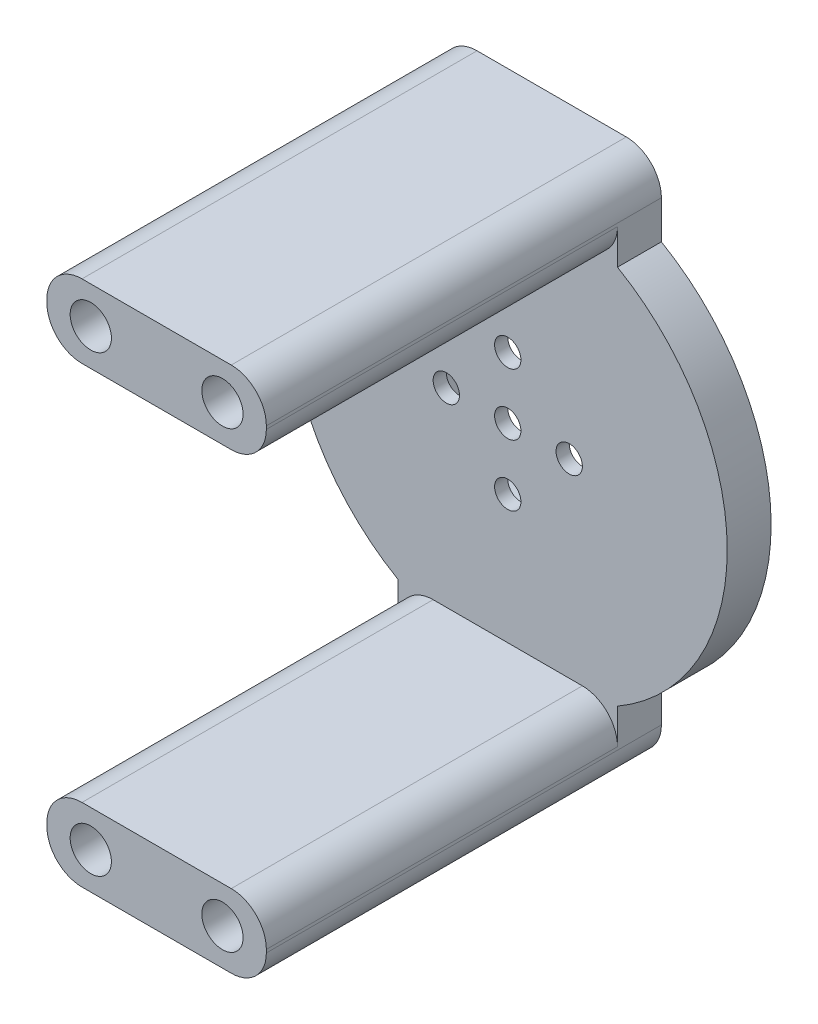
ISO-10303-21;
HEADER;
FILE_DESCRIPTION(('STEP AP214'),'2;1');
FILE_NAME('part.step','',(''),(''),'','','');
FILE_SCHEMA(('AUTOMOTIVE_DESIGN { 1 0 10303 214 1 1 1 1 }'));
ENDSEC;
DATA;
#1=APPLICATION_CONTEXT('core data for automotive mechanical design processes');
#2=APPLICATION_PROTOCOL_DEFINITION('international standard','automotive_design',2000,#1);
#3=PRODUCT_CONTEXT('',#1,'mechanical');
#4=PRODUCT('Part','Part','',(#3));
#5=PRODUCT_RELATED_PRODUCT_CATEGORY('part','',(#4));
#6=PRODUCT_DEFINITION_FORMATION('','',#4);
#7=PRODUCT_DEFINITION_CONTEXT('part definition',#1,'design');
#8=PRODUCT_DEFINITION('design','',#6,#7);
#9=PRODUCT_DEFINITION_SHAPE('','',#8);
#10=(LENGTH_UNIT() NAMED_UNIT(*) SI_UNIT(.MILLI.,.METRE.));
#11=(NAMED_UNIT(*) PLANE_ANGLE_UNIT() SI_UNIT($,.RADIAN.));
#12=(NAMED_UNIT(*) SI_UNIT($,.STERADIAN.) SOLID_ANGLE_UNIT());
#13=UNCERTAINTY_MEASURE_WITH_UNIT(LENGTH_MEASURE(1.E-05),#10,'distance_accuracy_value','');
#14=(GEOMETRIC_REPRESENTATION_CONTEXT(3) GLOBAL_UNCERTAINTY_ASSIGNED_CONTEXT((#13)) GLOBAL_UNIT_ASSIGNED_CONTEXT((#10,
#11,#12)) REPRESENTATION_CONTEXT('',''));
#15=CARTESIAN_POINT('',(0.,0.,0.));
#16=DIRECTION('',(0.,0.,1.));
#17=DIRECTION('',(1.,0.,0.));
#18=AXIS2_PLACEMENT_3D('',#15,#16,#17);
#19=CARTESIAN_POINT('',(0.,0.,5.));
#20=DIRECTION('',(0.,0.,1.));
#21=DIRECTION('',(1.,0.,0.));
#22=AXIS2_PLACEMENT_3D('',#19,#20,#21);
#23=PLANE('',#22);
#24=CARTESIAN_POINT('',(0.,0.,5.));
#25=DIRECTION('',(0.,0.,1.));
#26=DIRECTION('',(1.,0.,0.));
#27=AXIS2_PLACEMENT_3D('',#24,#25,#26);
#28=CIRCLE('',#27,1.5);
#29=CARTESIAN_POINT('',(1.5,0.,5.));
#30=VERTEX_POINT('',#29);
#31=EDGE_CURVE('E327',#30,#30,#28,.T.);
#32=ORIENTED_EDGE('',*,*,#31,.F.);
#33=EDGE_LOOP('',(#32));
#34=FACE_BOUND('',#33,.T.);
#35=CARTESIAN_POINT('',(-7.,0.,5.));
#36=DIRECTION('',(0.,0.,1.));
#37=DIRECTION('',(1.,0.,0.));
#38=AXIS2_PLACEMENT_3D('',#35,#36,#37);
#39=CIRCLE('',#38,1.5);
#40=CARTESIAN_POINT('',(-5.5,0.,5.));
#41=VERTEX_POINT('',#40);
#42=EDGE_CURVE('E330',#41,#41,#39,.T.);
#43=ORIENTED_EDGE('',*,*,#42,.F.);
#44=EDGE_LOOP('',(#43));
#45=FACE_BOUND('',#44,.T.);
#46=CARTESIAN_POINT('',(0.,-7.,5.));
#47=DIRECTION('',(0.,0.,1.));
#48=DIRECTION('',(1.,0.,0.));
#49=AXIS2_PLACEMENT_3D('',#46,#47,#48);
#50=CIRCLE('',#49,1.5);
#51=CARTESIAN_POINT('',(1.49999999999995,-7.,5.));
#52=VERTEX_POINT('',#51);
#53=EDGE_CURVE('E333',#52,#52,#50,.T.);
#54=ORIENTED_EDGE('',*,*,#53,.F.);
#55=EDGE_LOOP('',(#54));
#56=FACE_BOUND('',#55,.T.);
#57=CARTESIAN_POINT('',(7.,0.,5.));
#58=DIRECTION('',(0.,0.,1.));
#59=DIRECTION('',(1.,0.,0.));
#60=AXIS2_PLACEMENT_3D('',#57,#58,#59);
#61=CIRCLE('',#60,1.5);
#62=CARTESIAN_POINT('',(8.5,0.,5.));
#63=VERTEX_POINT('',#62);
#64=EDGE_CURVE('E336',#63,#63,#61,.T.);
#65=ORIENTED_EDGE('',*,*,#64,.F.);
#66=EDGE_LOOP('',(#65));
#67=FACE_BOUND('',#66,.T.);
#68=CARTESIAN_POINT('',(0.,7.,5.));
#69=DIRECTION('',(0.,0.,1.));
#70=DIRECTION('',(1.,0.,0.));
#71=AXIS2_PLACEMENT_3D('',#68,#69,#70);
#72=CIRCLE('',#71,1.5);
#73=CARTESIAN_POINT('',(1.5,7.,5.));
#74=VERTEX_POINT('',#73);
#75=EDGE_CURVE('E339',#74,#74,#72,.T.);
#76=ORIENTED_EDGE('',*,*,#75,.F.);
#77=EDGE_LOOP('',(#76));
#78=FACE_BOUND('',#77,.T.);
#79=CARTESIAN_POINT('',(0.,0.,5.));
#80=DIRECTION('',(0.,0.,1.));
#81=DIRECTION('',(1.,0.,0.));
#82=AXIS2_PLACEMENT_3D('',#79,#80,#81);
#83=CIRCLE('',#82,25.);
#84=CARTESIAN_POINT('',(-12.5,21.650635094611,5.));
#85=VERTEX_POINT('',#84);
#86=CARTESIAN_POINT('',(-12.5,-21.650635094611,5.));
#87=VERTEX_POINT('',#86);
#88=EDGE_CURVE('E187',#85,#87,#83,.T.);
#89=ORIENTED_EDGE('',*,*,#88,.T.);
#90=DIRECTION('',(0.,1.,0.));
#91=VECTOR('',#90,1.);
#92=CARTESIAN_POINT('',(-12.5,0.,5.));
#93=LINE('',#92,#91);
#94=CARTESIAN_POINT('',(-12.5,-25.650635094611,5.));
#95=VERTEX_POINT('',#94);
#96=EDGE_CURVE('E175',#95,#87,#93,.T.);
#97=ORIENTED_EDGE('',*,*,#96,.F.);
#98=CARTESIAN_POINT('',(-8.5,-25.650635094611,5.));
#99=DIRECTION('',(0.,0.,1.));
#100=DIRECTION('',(1.,0.,0.));
#101=AXIS2_PLACEMENT_3D('',#98,#99,#100);
#102=CIRCLE('',#101,4.);
#103=CARTESIAN_POINT('',(-8.5,-21.650635094611,5.));
#104=VERTEX_POINT('',#103);
#105=EDGE_CURVE('E272',#95,#104,#102,.F.);
#106=ORIENTED_EDGE('',*,*,#105,.T.);
#107=DIRECTION('',(-1.,0.,0.));
#108=VECTOR('',#107,1.);
#109=CARTESIAN_POINT('',(-12.5,-21.650635094611,5.));
#110=LINE('',#109,#108);
#111=CARTESIAN_POINT('',(8.5,-21.650635094611,5.));
#112=VERTEX_POINT('',#111);
#113=EDGE_CURVE('E288',#112,#104,#110,.T.);
#114=ORIENTED_EDGE('',*,*,#113,.F.);
#115=CARTESIAN_POINT('',(8.5,-25.650635094611,5.));
#116=DIRECTION('',(0.,0.,1.));
#117=DIRECTION('',(1.,0.,0.));
#118=AXIS2_PLACEMENT_3D('',#115,#116,#117);
#119=CIRCLE('',#118,4.);
#120=CARTESIAN_POINT('',(12.5,-25.650635094611,5.));
#121=VERTEX_POINT('',#120);
#122=EDGE_CURVE('E274',#112,#121,#119,.F.);
#123=ORIENTED_EDGE('',*,*,#122,.T.);
#124=DIRECTION('',(0.,-1.,0.));
#125=VECTOR('',#124,1.);
#126=CARTESIAN_POINT('',(12.5,0.,5.));
#127=LINE('',#126,#125);
#128=CARTESIAN_POINT('',(12.5,-21.650635094611,5.));
#129=VERTEX_POINT('',#128);
#130=EDGE_CURVE('E58',#129,#121,#127,.T.);
#131=ORIENTED_EDGE('',*,*,#130,.F.);
#132=CARTESIAN_POINT('',(0.,0.,5.));
#133=DIRECTION('',(0.,0.,1.));
#134=DIRECTION('',(1.,0.,0.));
#135=AXIS2_PLACEMENT_3D('',#132,#133,#134);
#136=CIRCLE('',#135,25.);
#137=CARTESIAN_POINT('',(12.5,21.650635094611,5.));
#138=VERTEX_POINT('',#137);
#139=EDGE_CURVE('E189',#129,#138,#136,.T.);
#140=ORIENTED_EDGE('',*,*,#139,.T.);
#141=DIRECTION('',(0.,-1.,0.));
#142=VECTOR('',#141,1.);
#143=CARTESIAN_POINT('',(12.5,0.,5.));
#144=LINE('',#143,#142);
#145=CARTESIAN_POINT('',(12.5,25.650635094611,5.));
#146=VERTEX_POINT('',#145);
#147=EDGE_CURVE('E243',#146,#138,#144,.T.);
#148=ORIENTED_EDGE('',*,*,#147,.F.);
#149=CARTESIAN_POINT('',(8.5,25.650635094611,5.));
#150=DIRECTION('',(0.,0.,1.));
#151=DIRECTION('',(1.,0.,0.));
#152=AXIS2_PLACEMENT_3D('',#149,#150,#151);
#153=CIRCLE('',#152,4.);
#154=CARTESIAN_POINT('',(8.5,21.650635094611,5.));
#155=VERTEX_POINT('',#154);
#156=EDGE_CURVE('E45',#146,#155,#153,.F.);
#157=ORIENTED_EDGE('',*,*,#156,.T.);
#158=DIRECTION('',(1.,0.,0.));
#159=VECTOR('',#158,1.);
#160=CARTESIAN_POINT('',(-12.5,21.650635094611,5.));
#161=LINE('',#160,#159);
#162=CARTESIAN_POINT('',(-8.5,21.650635094611,5.));
#163=VERTEX_POINT('',#162);
#164=EDGE_CURVE('E278',#163,#155,#161,.T.);
#165=ORIENTED_EDGE('',*,*,#164,.F.);
#166=CARTESIAN_POINT('',(-8.5,25.650635094611,5.));
#167=DIRECTION('',(0.,0.,1.));
#168=DIRECTION('',(1.,0.,0.));
#169=AXIS2_PLACEMENT_3D('',#166,#167,#168);
#170=CIRCLE('',#169,4.);
#171=CARTESIAN_POINT('',(-12.5,25.650635094611,5.));
#172=VERTEX_POINT('',#171);
#173=EDGE_CURVE('E11',#163,#172,#170,.F.);
#174=ORIENTED_EDGE('',*,*,#173,.T.);
#175=DIRECTION('',(0.,1.,0.));
#176=VECTOR('',#175,1.);
#177=CARTESIAN_POINT('',(-12.5,0.,5.));
#178=LINE('',#177,#176);
#179=EDGE_CURVE('E51',#85,#172,#178,.T.);
#180=ORIENTED_EDGE('',*,*,#179,.F.);
#181=EDGE_LOOP('',(#89,#97,#106,#114,#123,#131,#140,#148,#157,#165,#174,#180));
#182=FACE_BOUND('',#181,.T.);
#183=ADVANCED_FACE('F37',(#34,#45,#56,#67,#78,#182),#23,.T.);
#184=CARTESIAN_POINT('',(7.,0.,5.));
#185=DIRECTION('',(0.,0.,-1.));
#186=DIRECTION('',(-1.,0.,0.));
#187=AXIS2_PLACEMENT_3D('',#184,#185,#186);
#188=CYLINDRICAL_SURFACE('',#187,1.5);
#189=ORIENTED_EDGE('',*,*,#64,.T.);
#190=EDGE_LOOP('',(#189));
#191=FACE_BOUND('',#190,.T.);
#192=CARTESIAN_POINT('',(7.,0.,3.5));
#193=DIRECTION('',(0.,0.,-1.));
#194=DIRECTION('',(-1.,0.,0.));
#195=AXIS2_PLACEMENT_3D('',#192,#193,#194);
#196=CIRCLE('',#195,1.5);
#197=CARTESIAN_POINT('',(5.5,0.,3.5));
#198=VERTEX_POINT('',#197);
#199=EDGE_CURVE('E323',#198,#198,#196,.T.);
#200=ORIENTED_EDGE('',*,*,#199,.T.);
#201=EDGE_LOOP('',(#200));
#202=FACE_BOUND('',#201,.T.);
#203=ADVANCED_FACE('F421',(#191,#202),#188,.F.);
#204=CARTESIAN_POINT('',(0.,-7.,5.));
#205=DIRECTION('',(0.,0.,-1.));
#206=DIRECTION('',(-1.,0.,0.));
#207=AXIS2_PLACEMENT_3D('',#204,#205,#206);
#208=CYLINDRICAL_SURFACE('',#207,1.5);
#209=ORIENTED_EDGE('',*,*,#53,.T.);
#210=EDGE_LOOP('',(#209));
#211=FACE_BOUND('',#210,.T.);
#212=CARTESIAN_POINT('',(0.,-7.,3.5));
#213=DIRECTION('',(0.,0.,-1.));
#214=DIRECTION('',(-1.,0.,0.));
#215=AXIS2_PLACEMENT_3D('',#212,#213,#214);
#216=CIRCLE('',#215,1.5);
#217=CARTESIAN_POINT('',(-1.50000000000005,-7.,3.5));
#218=VERTEX_POINT('',#217);
#219=EDGE_CURVE('E320',#218,#218,#216,.T.);
#220=ORIENTED_EDGE('',*,*,#219,.T.);
#221=EDGE_LOOP('',(#220));
#222=FACE_BOUND('',#221,.T.);
#223=ADVANCED_FACE('F427',(#211,#222),#208,.F.);
#224=CARTESIAN_POINT('',(-7.,0.,5.));
#225=DIRECTION('',(0.,0.,-1.));
#226=DIRECTION('',(-1.,0.,0.));
#227=AXIS2_PLACEMENT_3D('',#224,#225,#226);
#228=CYLINDRICAL_SURFACE('',#227,1.5);
#229=ORIENTED_EDGE('',*,*,#42,.T.);
#230=EDGE_LOOP('',(#229));
#231=FACE_BOUND('',#230,.T.);
#232=CARTESIAN_POINT('',(-7.,0.,3.5));
#233=DIRECTION('',(0.,0.,-1.));
#234=DIRECTION('',(-1.,0.,0.));
#235=AXIS2_PLACEMENT_3D('',#232,#233,#234);
#236=CIRCLE('',#235,1.5);
#237=CARTESIAN_POINT('',(-8.5,0.,3.5));
#238=VERTEX_POINT('',#237);
#239=EDGE_CURVE('E317',#238,#238,#236,.T.);
#240=ORIENTED_EDGE('',*,*,#239,.T.);
#241=EDGE_LOOP('',(#240));
#242=FACE_BOUND('',#241,.T.);
#243=ADVANCED_FACE('F446',(#231,#242),#228,.F.);
#244=CARTESIAN_POINT('',(0.,0.,5.));
#245=DIRECTION('',(0.,0.,-1.));
#246=DIRECTION('',(-1.,0.,0.));
#247=AXIS2_PLACEMENT_3D('',#244,#245,#246);
#248=CYLINDRICAL_SURFACE('',#247,1.5);
#249=ORIENTED_EDGE('',*,*,#31,.T.);
#250=EDGE_LOOP('',(#249));
#251=FACE_BOUND('',#250,.T.);
#252=CARTESIAN_POINT('',(0.,0.,3.5));
#253=DIRECTION('',(0.,0.,-1.));
#254=DIRECTION('',(-1.,0.,0.));
#255=AXIS2_PLACEMENT_3D('',#252,#253,#254);
#256=CIRCLE('',#255,1.5);
#257=CARTESIAN_POINT('',(-1.5,0.,3.5));
#258=VERTEX_POINT('',#257);
#259=EDGE_CURVE('E207',#258,#258,#256,.T.);
#260=ORIENTED_EDGE('',*,*,#259,.T.);
#261=EDGE_LOOP('',(#260));
#262=FACE_BOUND('',#261,.T.);
#263=ADVANCED_FACE('F441',(#251,#262),#248,.F.);
#264=CARTESIAN_POINT('',(0.,7.,5.));
#265=DIRECTION('',(0.,0.,-1.));
#266=DIRECTION('',(-1.,0.,0.));
#267=AXIS2_PLACEMENT_3D('',#264,#265,#266);
#268=CYLINDRICAL_SURFACE('',#267,1.5);
#269=ORIENTED_EDGE('',*,*,#75,.T.);
#270=EDGE_LOOP('',(#269));
#271=FACE_BOUND('',#270,.T.);
#272=CARTESIAN_POINT('',(0.,7.,3.5));
#273=DIRECTION('',(0.,0.,-1.));
#274=DIRECTION('',(-1.,0.,0.));
#275=AXIS2_PLACEMENT_3D('',#272,#273,#274);
#276=CIRCLE('',#275,1.5);
#277=CARTESIAN_POINT('',(-1.5,7.,3.5));
#278=VERTEX_POINT('',#277);
#279=EDGE_CURVE('E205',#278,#278,#276,.T.);
#280=ORIENTED_EDGE('',*,*,#279,.T.);
#281=EDGE_LOOP('',(#280));
#282=FACE_BOUND('',#281,.T.);
#283=ADVANCED_FACE('F439',(#271,#282),#268,.F.);
#284=CARTESIAN_POINT('',(0.,0.,5.));
#285=DIRECTION('',(0.,0.,-1.));
#286=DIRECTION('',(-1.,0.,0.));
#287=AXIS2_PLACEMENT_3D('',#284,#285,#286);
#288=CYLINDRICAL_SURFACE('',#287,25.);
#289=CARTESIAN_POINT('',(0.,0.,0.));
#290=DIRECTION('',(0.,0.,1.));
#291=DIRECTION('',(1.,0.,0.));
#292=AXIS2_PLACEMENT_3D('',#289,#290,#291);
#293=CIRCLE('',#292,25.);
#294=CARTESIAN_POINT('',(-12.5,21.650635094611,0.));
#295=VERTEX_POINT('',#294);
#296=CARTESIAN_POINT('',(-12.5,-21.650635094611,0.));
#297=VERTEX_POINT('',#296);
#298=EDGE_CURVE('E194',#295,#297,#293,.T.);
#299=ORIENTED_EDGE('',*,*,#298,.T.);
#300=DIRECTION('',(0.,0.,-1.));
#301=VECTOR('',#300,1.);
#302=CARTESIAN_POINT('',(-12.5,-21.650635094611,5.));
#303=LINE('',#302,#301);
#304=EDGE_CURVE('E179',#87,#297,#303,.T.);
#305=ORIENTED_EDGE('',*,*,#304,.F.);
#306=ORIENTED_EDGE('',*,*,#88,.F.);
#307=DIRECTION('',(0.,0.,-1.));
#308=VECTOR('',#307,1.);
#309=CARTESIAN_POINT('',(-12.5,21.650635094611,5.));
#310=LINE('',#309,#308);
#311=EDGE_CURVE('E342',#85,#295,#310,.T.);
#312=ORIENTED_EDGE('',*,*,#311,.T.);
#313=EDGE_LOOP('',(#299,#305,#306,#312));
#314=FACE_BOUND('',#313,.T.);
#315=ADVANCED_FACE('F192',(#314),#288,.T.);
#316=CARTESIAN_POINT('',(-12.5,0.,5.));
#317=DIRECTION('',(-1.,0.,0.));
#318=DIRECTION('',(0.,0.,1.));
#319=AXIS2_PLACEMENT_3D('',#316,#317,#318);
#320=PLANE('',#319);
#321=DIRECTION('',(0.,1.,0.));
#322=VECTOR('',#321,1.);
#323=CARTESIAN_POINT('',(-12.5,0.,0.));
#324=LINE('',#323,#322);
#325=CARTESIAN_POINT('',(-12.5,-26.,0.));
#326=VERTEX_POINT('',#325);
#327=EDGE_CURVE('E344',#326,#297,#324,.T.);
#328=ORIENTED_EDGE('',*,*,#327,.F.);
#329=DIRECTION('',(0.,0.,-1.));
#330=VECTOR('',#329,1.);
#331=CARTESIAN_POINT('',(-12.5,-26.,45.));
#332=LINE('',#331,#330);
#333=CARTESIAN_POINT('',(-12.5,-26.,45.));
#334=VERTEX_POINT('',#333);
#335=EDGE_CURVE('E220',#326,#334,#332,.F.);
#336=ORIENTED_EDGE('',*,*,#335,.T.);
#337=DIRECTION('',(0.,-1.,0.));
#338=VECTOR('',#337,1.);
#339=CARTESIAN_POINT('',(-12.5,-30.,45.));
#340=LINE('',#339,#338);
#341=CARTESIAN_POINT('',(-12.5,-25.650635094611,45.));
#342=VERTEX_POINT('',#341);
#343=EDGE_CURVE('E398',#342,#334,#340,.T.);
#344=ORIENTED_EDGE('',*,*,#343,.F.);
#345=DIRECTION('',(0.,0.,-1.));
#346=VECTOR('',#345,1.);
#347=CARTESIAN_POINT('',(-12.5,-25.650635094611,5.));
#348=LINE('',#347,#346);
#349=EDGE_CURVE('E183',#342,#95,#348,.T.);
#350=ORIENTED_EDGE('',*,*,#349,.T.);
#351=ORIENTED_EDGE('',*,*,#96,.T.);
#352=ORIENTED_EDGE('',*,*,#304,.T.);
#353=EDGE_LOOP('',(#328,#336,#344,#350,#351,#352));
#354=FACE_BOUND('',#353,.T.);
#355=ADVANCED_FACE('F177',(#354),#320,.T.);
#356=CARTESIAN_POINT('',(0.,-30.,5.));
#357=DIRECTION('',(0.,1.,0.));
#358=DIRECTION('',(0.,0.,1.));
#359=AXIS2_PLACEMENT_3D('',#356,#357,#358);
#360=PLANE('',#359);
#361=DIRECTION('',(1.,0.,0.));
#362=VECTOR('',#361,1.);
#363=CARTESIAN_POINT('',(-12.5,-30.,45.));
#364=LINE('',#363,#362);
#365=CARTESIAN_POINT('',(-8.5,-30.,45.));
#366=VERTEX_POINT('',#365);
#367=CARTESIAN_POINT('',(8.5,-30.,45.));
#368=VERTEX_POINT('',#367);
#369=EDGE_CURVE('E396',#366,#368,#364,.T.);
#370=ORIENTED_EDGE('',*,*,#369,.F.);
#371=DIRECTION('',(0.,0.,-1.));
#372=VECTOR('',#371,1.);
#373=CARTESIAN_POINT('',(-8.5,-30.,0.));
#374=LINE('',#373,#372);
#375=CARTESIAN_POINT('',(-8.5,-30.,0.));
#376=VERTEX_POINT('',#375);
#377=EDGE_CURVE('E198',#366,#376,#374,.T.);
#378=ORIENTED_EDGE('',*,*,#377,.T.);
#379=DIRECTION('',(1.,0.,0.));
#380=VECTOR('',#379,1.);
#381=CARTESIAN_POINT('',(0.,-30.,0.));
#382=LINE('',#381,#380);
#383=CARTESIAN_POINT('',(8.5,-30.,0.));
#384=VERTEX_POINT('',#383);
#385=EDGE_CURVE('E346',#376,#384,#382,.T.);
#386=ORIENTED_EDGE('',*,*,#385,.T.);
#387=DIRECTION('',(0.,0.,-1.));
#388=VECTOR('',#387,1.);
#389=CARTESIAN_POINT('',(8.5,-30.,5.));
#390=LINE('',#389,#388);
#391=EDGE_CURVE('E195',#384,#368,#390,.F.);
#392=ORIENTED_EDGE('',*,*,#391,.T.);
#393=EDGE_LOOP('',(#370,#378,#386,#392));
#394=FACE_BOUND('',#393,.T.);
#395=ADVANCED_FACE('F400',(#394),#360,.F.);
#396=CARTESIAN_POINT('',(12.5,0.,5.));
#397=DIRECTION('',(-1.,0.,0.));
#398=DIRECTION('',(0.,0.,1.));
#399=AXIS2_PLACEMENT_3D('',#396,#397,#398);
#400=PLANE('',#399);
#401=DIRECTION('',(0.,1.,0.));
#402=VECTOR('',#401,1.);
#403=CARTESIAN_POINT('',(12.5,-30.,45.));
#404=LINE('',#403,#402);
#405=CARTESIAN_POINT('',(12.5,-26.,45.));
#406=VERTEX_POINT('',#405);
#407=CARTESIAN_POINT('',(12.5,-25.650635094611,45.));
#408=VERTEX_POINT('',#407);
#409=EDGE_CURVE('E402',#406,#408,#404,.T.);
#410=ORIENTED_EDGE('',*,*,#409,.F.);
#411=DIRECTION('',(0.,0.,-1.));
#412=VECTOR('',#411,1.);
#413=CARTESIAN_POINT('',(12.5,-26.,5.));
#414=LINE('',#413,#412);
#415=CARTESIAN_POINT('',(12.5,-26.,0.));
#416=VERTEX_POINT('',#415);
#417=EDGE_CURVE('E238',#406,#416,#414,.T.);
#418=ORIENTED_EDGE('',*,*,#417,.T.);
#419=DIRECTION('',(0.,1.,0.));
#420=VECTOR('',#419,1.);
#421=CARTESIAN_POINT('',(12.5,0.,0.));
#422=LINE('',#421,#420);
#423=CARTESIAN_POINT('',(12.5,-21.650635094611,0.));
#424=VERTEX_POINT('',#423);
#425=EDGE_CURVE('E349',#416,#424,#422,.T.);
#426=ORIENTED_EDGE('',*,*,#425,.T.);
#427=DIRECTION('',(0.,0.,-1.));
#428=VECTOR('',#427,1.);
#429=CARTESIAN_POINT('',(12.5,-21.650635094611,5.));
#430=LINE('',#429,#428);
#431=EDGE_CURVE('E196',#129,#424,#430,.T.);
#432=ORIENTED_EDGE('',*,*,#431,.F.);
#433=ORIENTED_EDGE('',*,*,#130,.T.);
#434=DIRECTION('',(0.,0.,-1.));
#435=VECTOR('',#434,1.);
#436=CARTESIAN_POINT('',(12.5,-25.650635094611,5.));
#437=LINE('',#436,#435);
#438=EDGE_CURVE('E235',#121,#408,#437,.F.);
#439=ORIENTED_EDGE('',*,*,#438,.T.);
#440=EDGE_LOOP('',(#410,#418,#426,#432,#433,#439));
#441=FACE_BOUND('',#440,.T.);
#442=ADVANCED_FACE('F463',(#441),#400,.F.);
#443=CARTESIAN_POINT('',(0.,0.,5.));
#444=DIRECTION('',(0.,0.,-1.));
#445=DIRECTION('',(-1.,0.,0.));
#446=AXIS2_PLACEMENT_3D('',#443,#444,#445);
#447=CYLINDRICAL_SURFACE('',#446,25.);
#448=CARTESIAN_POINT('',(0.,0.,0.));
#449=DIRECTION('',(0.,0.,1.));
#450=DIRECTION('',(1.,0.,0.));
#451=AXIS2_PLACEMENT_3D('',#448,#449,#450);
#452=CIRCLE('',#451,25.);
#453=CARTESIAN_POINT('',(12.5,21.650635094611,0.));
#454=VERTEX_POINT('',#453);
#455=EDGE_CURVE('E351',#424,#454,#452,.T.);
#456=ORIENTED_EDGE('',*,*,#455,.T.);
#457=DIRECTION('',(0.,0.,-1.));
#458=VECTOR('',#457,1.);
#459=CARTESIAN_POINT('',(12.5,21.650635094611,5.));
#460=LINE('',#459,#458);
#461=EDGE_CURVE('E201',#138,#454,#460,.T.);
#462=ORIENTED_EDGE('',*,*,#461,.F.);
#463=ORIENTED_EDGE('',*,*,#139,.F.);
#464=ORIENTED_EDGE('',*,*,#431,.T.);
#465=EDGE_LOOP('',(#456,#462,#463,#464));
#466=FACE_BOUND('',#465,.T.);
#467=ADVANCED_FACE('F460',(#466),#447,.T.);
#468=CARTESIAN_POINT('',(12.5,0.,5.));
#469=DIRECTION('',(-1.,0.,0.));
#470=DIRECTION('',(0.,0.,1.));
#471=AXIS2_PLACEMENT_3D('',#468,#469,#470);
#472=PLANE('',#471);
#473=DIRECTION('',(0.,1.,0.));
#474=VECTOR('',#473,1.);
#475=CARTESIAN_POINT('',(12.5,30.,45.));
#476=LINE('',#475,#474);
#477=CARTESIAN_POINT('',(12.5,25.650635094611,45.));
#478=VERTEX_POINT('',#477);
#479=CARTESIAN_POINT('',(12.5,26.,45.));
#480=VERTEX_POINT('',#479);
#481=EDGE_CURVE('E296',#478,#480,#476,.T.);
#482=ORIENTED_EDGE('',*,*,#481,.F.);
#483=DIRECTION('',(0.,0.,-1.));
#484=VECTOR('',#483,1.);
#485=CARTESIAN_POINT('',(12.5,25.650635094611,5.));
#486=LINE('',#485,#484);
#487=EDGE_CURVE('E245',#478,#146,#486,.T.);
#488=ORIENTED_EDGE('',*,*,#487,.T.);
#489=ORIENTED_EDGE('',*,*,#147,.T.);
#490=ORIENTED_EDGE('',*,*,#461,.T.);
#491=DIRECTION('',(0.,1.,0.));
#492=VECTOR('',#491,1.);
#493=CARTESIAN_POINT('',(12.5,0.,0.));
#494=LINE('',#493,#492);
#495=CARTESIAN_POINT('',(12.5,26.,0.));
#496=VERTEX_POINT('',#495);
#497=EDGE_CURVE('E353',#454,#496,#494,.T.);
#498=ORIENTED_EDGE('',*,*,#497,.T.);
#499=DIRECTION('',(0.,0.,-1.));
#500=VECTOR('',#499,1.);
#501=CARTESIAN_POINT('',(12.5,26.,45.));
#502=LINE('',#501,#500);
#503=EDGE_CURVE('E241',#496,#480,#502,.F.);
#504=ORIENTED_EDGE('',*,*,#503,.T.);
#505=EDGE_LOOP('',(#482,#488,#489,#490,#498,#504));
#506=FACE_BOUND('',#505,.T.);
#507=ADVANCED_FACE('F300',(#506),#472,.F.);
#508=CARTESIAN_POINT('',(0.,30.,5.));
#509=DIRECTION('',(0.,1.,0.));
#510=DIRECTION('',(0.,0.,1.));
#511=AXIS2_PLACEMENT_3D('',#508,#509,#510);
#512=PLANE('',#511);
#513=DIRECTION('',(-1.,0.,0.));
#514=VECTOR('',#513,1.);
#515=CARTESIAN_POINT('',(-12.5,30.,45.));
#516=LINE('',#515,#514);
#517=CARTESIAN_POINT('',(8.5,30.,45.));
#518=VERTEX_POINT('',#517);
#519=CARTESIAN_POINT('',(-8.5,30.,45.));
#520=VERTEX_POINT('',#519);
#521=EDGE_CURVE('E303',#518,#520,#516,.T.);
#522=ORIENTED_EDGE('',*,*,#521,.F.);
#523=DIRECTION('',(0.,0.,-1.));
#524=VECTOR('',#523,1.);
#525=CARTESIAN_POINT('',(8.5,30.,0.));
#526=LINE('',#525,#524);
#527=CARTESIAN_POINT('',(8.5,30.,0.));
#528=VERTEX_POINT('',#527);
#529=EDGE_CURVE('E263',#518,#528,#526,.T.);
#530=ORIENTED_EDGE('',*,*,#529,.T.);
#531=DIRECTION('',(1.,0.,0.));
#532=VECTOR('',#531,1.);
#533=CARTESIAN_POINT('',(0.,30.,0.));
#534=LINE('',#533,#532);
#535=CARTESIAN_POINT('',(-8.5,30.,0.));
#536=VERTEX_POINT('',#535);
#537=EDGE_CURVE('E355',#536,#528,#534,.T.);
#538=ORIENTED_EDGE('',*,*,#537,.F.);
#539=DIRECTION('',(0.,0.,-1.));
#540=VECTOR('',#539,1.);
#541=CARTESIAN_POINT('',(-8.5,30.,5.));
#542=LINE('',#541,#540);
#543=EDGE_CURVE('E261',#536,#520,#542,.F.);
#544=ORIENTED_EDGE('',*,*,#543,.T.);
#545=EDGE_LOOP('',(#522,#530,#538,#544));
#546=FACE_BOUND('',#545,.T.);
#547=ADVANCED_FACE('F376',(#546),#512,.T.);
#548=CARTESIAN_POINT('',(-12.5,0.,5.));
#549=DIRECTION('',(-1.,0.,0.));
#550=DIRECTION('',(0.,0.,1.));
#551=AXIS2_PLACEMENT_3D('',#548,#549,#550);
#552=PLANE('',#551);
#553=ORIENTED_EDGE('',*,*,#311,.F.);
#554=ORIENTED_EDGE('',*,*,#179,.T.);
#555=DIRECTION('',(0.,0.,-1.));
#556=VECTOR('',#555,1.);
#557=CARTESIAN_POINT('',(-12.5,25.650635094611,45.));
#558=LINE('',#557,#556);
#559=CARTESIAN_POINT('',(-12.5,25.650635094611,45.));
#560=VERTEX_POINT('',#559);
#561=EDGE_CURVE('E269',#172,#560,#558,.F.);
#562=ORIENTED_EDGE('',*,*,#561,.T.);
#563=DIRECTION('',(0.,-1.,0.));
#564=VECTOR('',#563,1.);
#565=CARTESIAN_POINT('',(-12.5,30.,45.));
#566=LINE('',#565,#564);
#567=CARTESIAN_POINT('',(-12.5,26.,45.));
#568=VERTEX_POINT('',#567);
#569=EDGE_CURVE('E287',#568,#560,#566,.T.);
#570=ORIENTED_EDGE('',*,*,#569,.F.);
#571=DIRECTION('',(0.,0.,-1.));
#572=VECTOR('',#571,1.);
#573=CARTESIAN_POINT('',(-12.5,26.,5.));
#574=LINE('',#573,#572);
#575=CARTESIAN_POINT('',(-12.5,26.,0.));
#576=VERTEX_POINT('',#575);
#577=EDGE_CURVE('E266',#568,#576,#574,.T.);
#578=ORIENTED_EDGE('',*,*,#577,.T.);
#579=DIRECTION('',(0.,1.,0.));
#580=VECTOR('',#579,1.);
#581=CARTESIAN_POINT('',(-12.5,0.,0.));
#582=LINE('',#581,#580);
#583=EDGE_CURVE('E190',#295,#576,#582,.T.);
#584=ORIENTED_EDGE('',*,*,#583,.F.);
#585=EDGE_LOOP('',(#553,#554,#562,#570,#578,#584));
#586=FACE_BOUND('',#585,.T.);
#587=ADVANCED_FACE('F385',(#586),#552,.T.);
#588=CARTESIAN_POINT('',(0.,0.,0.));
#589=DIRECTION('',(0.,0.,1.));
#590=DIRECTION('',(1.,0.,0.));
#591=AXIS2_PLACEMENT_3D('',#588,#589,#590);
#592=PLANE('',#591);
#593=CARTESIAN_POINT('',(0.,0.,0.));
#594=DIRECTION('',(0.,0.,-1.));
#595=DIRECTION('',(-1.,0.,0.));
#596=AXIS2_PLACEMENT_3D('',#593,#594,#595);
#597=CIRCLE('',#596,10.5);
#598=CARTESIAN_POINT('',(-10.5,0.,0.));
#599=VERTEX_POINT('',#598);
#600=EDGE_CURVE('E306',#599,#599,#597,.T.);
#601=ORIENTED_EDGE('',*,*,#600,.F.);
#602=EDGE_LOOP('',(#601));
#603=FACE_BOUND('',#602,.T.);
#604=ORIENTED_EDGE('',*,*,#385,.F.);
#605=CARTESIAN_POINT('',(-8.5,-26.,0.));
#606=DIRECTION('',(0.,0.,1.));
#607=DIRECTION('',(1.,0.,0.));
#608=AXIS2_PLACEMENT_3D('',#605,#606,#607);
#609=CIRCLE('',#608,4.);
#610=EDGE_CURVE('E184',#376,#326,#609,.F.);
#611=ORIENTED_EDGE('',*,*,#610,.T.);
#612=ORIENTED_EDGE('',*,*,#327,.T.);
#613=ORIENTED_EDGE('',*,*,#298,.F.);
#614=ORIENTED_EDGE('',*,*,#583,.T.);
#615=CARTESIAN_POINT('',(-8.5,26.,0.));
#616=DIRECTION('',(0.,0.,1.));
#617=DIRECTION('',(1.,0.,0.));
#618=AXIS2_PLACEMENT_3D('',#615,#616,#617);
#619=CIRCLE('',#618,4.);
#620=EDGE_CURVE('E212',#576,#536,#619,.F.);
#621=ORIENTED_EDGE('',*,*,#620,.T.);
#622=ORIENTED_EDGE('',*,*,#537,.T.);
#623=CARTESIAN_POINT('',(8.5,26.,0.));
#624=DIRECTION('',(0.,0.,1.));
#625=DIRECTION('',(1.,0.,0.));
#626=AXIS2_PLACEMENT_3D('',#623,#624,#625);
#627=CIRCLE('',#626,4.);
#628=EDGE_CURVE('E214',#528,#496,#627,.F.);
#629=ORIENTED_EDGE('',*,*,#628,.T.);
#630=ORIENTED_EDGE('',*,*,#497,.F.);
#631=ORIENTED_EDGE('',*,*,#455,.F.);
#632=ORIENTED_EDGE('',*,*,#425,.F.);
#633=CARTESIAN_POINT('',(8.5,-26.,0.));
#634=DIRECTION('',(0.,0.,1.));
#635=DIRECTION('',(1.,0.,0.));
#636=AXIS2_PLACEMENT_3D('',#633,#634,#635);
#637=CIRCLE('',#636,4.);
#638=EDGE_CURVE('E216',#416,#384,#637,.F.);
#639=ORIENTED_EDGE('',*,*,#638,.T.);
#640=EDGE_LOOP('',(#604,#611,#612,#613,#614,#621,#622,#629,#630,#631,#632,#639));
#641=FACE_BOUND('',#640,.T.);
#642=ADVANCED_FACE('F368',(#603,#641),#592,.F.);
#643=CARTESIAN_POINT('',(0.,0.,3.5));
#644=DIRECTION('',(0.,0.,-1.));
#645=DIRECTION('',(-1.,0.,0.));
#646=AXIS2_PLACEMENT_3D('',#643,#644,#645);
#647=CYLINDRICAL_SURFACE('',#646,10.5);
#648=CARTESIAN_POINT('',(0.,0.,3.5));
#649=DIRECTION('',(0.,0.,-1.));
#650=DIRECTION('',(-1.,0.,0.));
#651=AXIS2_PLACEMENT_3D('',#648,#649,#650);
#652=CIRCLE('',#651,10.5);
#653=CARTESIAN_POINT('',(-10.5,0.,3.5));
#654=VERTEX_POINT('',#653);
#655=EDGE_CURVE('E208',#654,#654,#652,.T.);
#656=ORIENTED_EDGE('',*,*,#655,.F.);
#657=EDGE_LOOP('',(#656));
#658=FACE_BOUND('',#657,.T.);
#659=ORIENTED_EDGE('',*,*,#600,.T.);
#660=EDGE_LOOP('',(#659));
#661=FACE_BOUND('',#660,.T.);
#662=ADVANCED_FACE('F434',(#658,#661),#647,.F.);
#663=CARTESIAN_POINT('',(0.,0.,3.5));
#664=DIRECTION('',(0.,0.,-1.));
#665=DIRECTION('',(-1.,0.,0.));
#666=AXIS2_PLACEMENT_3D('',#663,#664,#665);
#667=PLANE('',#666);
#668=ORIENTED_EDGE('',*,*,#199,.F.);
#669=EDGE_LOOP('',(#668));
#670=FACE_BOUND('',#669,.T.);
#671=ORIENTED_EDGE('',*,*,#219,.F.);
#672=EDGE_LOOP('',(#671));
#673=FACE_BOUND('',#672,.T.);
#674=ORIENTED_EDGE('',*,*,#239,.F.);
#675=EDGE_LOOP('',(#674));
#676=FACE_BOUND('',#675,.T.);
#677=ORIENTED_EDGE('',*,*,#259,.F.);
#678=EDGE_LOOP('',(#677));
#679=FACE_BOUND('',#678,.T.);
#680=ORIENTED_EDGE('',*,*,#279,.F.);
#681=EDGE_LOOP('',(#680));
#682=FACE_BOUND('',#681,.T.);
#683=ORIENTED_EDGE('',*,*,#655,.T.);
#684=EDGE_LOOP('',(#683));
#685=FACE_BOUND('',#684,.T.);
#686=ADVANCED_FACE('F675',(#670,#673,#676,#679,#682,#685),#667,.T.);
#687=CARTESIAN_POINT('',(-12.5,21.650635094611,45.));
#688=DIRECTION('',(0.,1.,0.));
#689=DIRECTION('',(0.,0.,1.));
#690=AXIS2_PLACEMENT_3D('',#687,#688,#689);
#691=PLANE('',#690);
#692=ORIENTED_EDGE('',*,*,#164,.T.);
#693=DIRECTION('',(0.,0.,-1.));
#694=VECTOR('',#693,1.);
#695=CARTESIAN_POINT('',(8.5,21.650635094611,45.));
#696=LINE('',#695,#694);
#697=CARTESIAN_POINT('',(8.5,21.650635094611,45.));
#698=VERTEX_POINT('',#697);
#699=EDGE_CURVE('E251',#155,#698,#696,.F.);
#700=ORIENTED_EDGE('',*,*,#699,.T.);
#701=DIRECTION('',(1.,0.,0.));
#702=VECTOR('',#701,1.);
#703=CARTESIAN_POINT('',(-12.5,21.650635094611,45.));
#704=LINE('',#703,#702);
#705=CARTESIAN_POINT('',(-8.5,21.650635094611,45.));
#706=VERTEX_POINT('',#705);
#707=EDGE_CURVE('E298',#706,#698,#704,.T.);
#708=ORIENTED_EDGE('',*,*,#707,.F.);
#709=DIRECTION('',(0.,0.,-1.));
#710=VECTOR('',#709,1.);
#711=CARTESIAN_POINT('',(-8.5,21.650635094611,5.));
#712=LINE('',#711,#710);
#713=EDGE_CURVE('E248',#706,#163,#712,.T.);
#714=ORIENTED_EDGE('',*,*,#713,.T.);
#715=EDGE_LOOP('',(#692,#700,#708,#714));
#716=FACE_BOUND('',#715,.T.);
#717=ADVANCED_FACE('F283',(#716),#691,.F.);
#718=CARTESIAN_POINT('',(0.,0.,45.));
#719=DIRECTION('',(0.,0.,1.));
#720=DIRECTION('',(1.,0.,0.));
#721=AXIS2_PLACEMENT_3D('',#718,#719,#720);
#722=PLANE('',#721);
#723=CARTESIAN_POINT('',(7.5,25.8253175473055,45.));
#724=DIRECTION('',(0.,0.,1.));
#725=DIRECTION('',(-1.,0.,0.));
#726=AXIS2_PLACEMENT_3D('',#723,#724,#725);
#727=CIRCLE('',#726,2.35);
#728=CARTESIAN_POINT('',(5.15,25.8253175473055,45.));
#729=VERTEX_POINT('',#728);
#730=EDGE_CURVE('E903',#729,#729,#727,.T.);
#731=ORIENTED_EDGE('',*,*,#730,.F.);
#732=EDGE_LOOP('',(#731));
#733=FACE_BOUND('',#732,.T.);
#734=CARTESIAN_POINT('',(-7.5,25.8253175473055,45.));
#735=DIRECTION('',(0.,0.,1.));
#736=DIRECTION('',(1.,0.,0.));
#737=AXIS2_PLACEMENT_3D('',#734,#735,#736);
#738=CIRCLE('',#737,2.35);
#739=CARTESIAN_POINT('',(-5.15,25.8253175473055,45.));
#740=VERTEX_POINT('',#739);
#741=EDGE_CURVE('E899',#740,#740,#738,.T.);
#742=ORIENTED_EDGE('',*,*,#741,.F.);
#743=EDGE_LOOP('',(#742));
#744=FACE_BOUND('',#743,.T.);
#745=ORIENTED_EDGE('',*,*,#707,.T.);
#746=CARTESIAN_POINT('',(8.5,25.650635094611,45.));
#747=DIRECTION('',(0.,0.,1.));
#748=DIRECTION('',(1.,0.,0.));
#749=AXIS2_PLACEMENT_3D('',#746,#747,#748);
#750=CIRCLE('',#749,4.);
#751=EDGE_CURVE('E259',#698,#478,#750,.T.);
#752=ORIENTED_EDGE('',*,*,#751,.T.);
#753=ORIENTED_EDGE('',*,*,#481,.T.);
#754=CARTESIAN_POINT('',(8.5,26.,45.));
#755=DIRECTION('',(0.,0.,1.));
#756=DIRECTION('',(1.,0.,0.));
#757=AXIS2_PLACEMENT_3D('',#754,#755,#756);
#758=CIRCLE('',#757,4.);
#759=EDGE_CURVE('E257',#480,#518,#758,.T.);
#760=ORIENTED_EDGE('',*,*,#759,.T.);
#761=ORIENTED_EDGE('',*,*,#521,.T.);
#762=CARTESIAN_POINT('',(-8.5,26.,45.));
#763=DIRECTION('',(0.,0.,1.));
#764=DIRECTION('',(1.,0.,0.));
#765=AXIS2_PLACEMENT_3D('',#762,#763,#764);
#766=CIRCLE('',#765,4.);
#767=EDGE_CURVE('E253',#520,#568,#766,.T.);
#768=ORIENTED_EDGE('',*,*,#767,.T.);
#769=ORIENTED_EDGE('',*,*,#569,.T.);
#770=CARTESIAN_POINT('',(-8.5,25.650635094611,45.));
#771=DIRECTION('',(0.,0.,1.));
#772=DIRECTION('',(1.,0.,0.));
#773=AXIS2_PLACEMENT_3D('',#770,#771,#772);
#774=CIRCLE('',#773,4.);
#775=EDGE_CURVE('E255',#560,#706,#774,.T.);
#776=ORIENTED_EDGE('',*,*,#775,.T.);
#777=EDGE_LOOP('',(#745,#752,#753,#760,#761,#768,#769,#776));
#778=FACE_BOUND('',#777,.T.);
#779=ADVANCED_FACE('F295',(#733,#744,#778),#722,.T.);
#780=CARTESIAN_POINT('',(-12.5,-21.650635094611,45.));
#781=DIRECTION('',(0.,-1.,0.));
#782=DIRECTION('',(0.,0.,-1.));
#783=AXIS2_PLACEMENT_3D('',#780,#781,#782);
#784=PLANE('',#783);
#785=ORIENTED_EDGE('',*,*,#113,.T.);
#786=DIRECTION('',(0.,0.,-1.));
#787=VECTOR('',#786,1.);
#788=CARTESIAN_POINT('',(-8.5,-21.650635094611,45.));
#789=LINE('',#788,#787);
#790=CARTESIAN_POINT('',(-8.5,-21.650635094611,45.));
#791=VERTEX_POINT('',#790);
#792=EDGE_CURVE('E233',#104,#791,#789,.F.);
#793=ORIENTED_EDGE('',*,*,#792,.T.);
#794=DIRECTION('',(-1.,0.,0.));
#795=VECTOR('',#794,1.);
#796=CARTESIAN_POINT('',(-12.5,-21.650635094611,45.));
#797=LINE('',#796,#795);
#798=CARTESIAN_POINT('',(8.5,-21.650635094611,45.));
#799=VERTEX_POINT('',#798);
#800=EDGE_CURVE('E406',#799,#791,#797,.T.);
#801=ORIENTED_EDGE('',*,*,#800,.F.);
#802=DIRECTION('',(0.,0.,-1.));
#803=VECTOR('',#802,1.);
#804=CARTESIAN_POINT('',(8.5,-21.650635094611,45.));
#805=LINE('',#804,#803);
#806=EDGE_CURVE('E230',#799,#112,#805,.T.);
#807=ORIENTED_EDGE('',*,*,#806,.T.);
#808=EDGE_LOOP('',(#785,#793,#801,#807));
#809=FACE_BOUND('',#808,.T.);
#810=ADVANCED_FACE('F520',(#809),#784,.F.);
#811=CARTESIAN_POINT('',(0.,0.,45.));
#812=DIRECTION('',(0.,0.,-1.));
#813=DIRECTION('',(-1.,0.,0.));
#814=AXIS2_PLACEMENT_3D('',#811,#812,#813);
#815=PLANE('',#814);
#816=CARTESIAN_POINT('',(-7.5,-25.8253175473055,45.));
#817=DIRECTION('',(0.,0.,1.));
#818=DIRECTION('',(-1.,0.,0.));
#819=AXIS2_PLACEMENT_3D('',#816,#817,#818);
#820=CIRCLE('',#819,2.35);
#821=CARTESIAN_POINT('',(-9.85,-25.8253175473055,45.));
#822=VERTEX_POINT('',#821);
#823=EDGE_CURVE('E908',#822,#822,#820,.T.);
#824=ORIENTED_EDGE('',*,*,#823,.F.);
#825=EDGE_LOOP('',(#824));
#826=FACE_BOUND('',#825,.T.);
#827=CARTESIAN_POINT('',(7.5,-25.8253175473055,45.));
#828=DIRECTION('',(0.,0.,1.));
#829=DIRECTION('',(1.,0.,0.));
#830=AXIS2_PLACEMENT_3D('',#827,#828,#829);
#831=CIRCLE('',#830,2.35);
#832=CARTESIAN_POINT('',(9.85,-25.8253175473055,45.));
#833=VERTEX_POINT('',#832);
#834=EDGE_CURVE('E914',#833,#833,#831,.T.);
#835=ORIENTED_EDGE('',*,*,#834,.F.);
#836=EDGE_LOOP('',(#835));
#837=FACE_BOUND('',#836,.T.);
#838=ORIENTED_EDGE('',*,*,#343,.T.);
#839=CARTESIAN_POINT('',(-8.5,-26.,45.));
#840=DIRECTION('',(0.,0.,-1.));
#841=DIRECTION('',(-1.,0.,0.));
#842=AXIS2_PLACEMENT_3D('',#839,#840,#841);
#843=CIRCLE('',#842,4.);
#844=EDGE_CURVE('E228',#334,#366,#843,.F.);
#845=ORIENTED_EDGE('',*,*,#844,.T.);
#846=ORIENTED_EDGE('',*,*,#369,.T.);
#847=CARTESIAN_POINT('',(8.5,-26.,45.));
#848=DIRECTION('',(0.,0.,-1.));
#849=DIRECTION('',(-1.,0.,0.));
#850=AXIS2_PLACEMENT_3D('',#847,#848,#849);
#851=CIRCLE('',#850,4.);
#852=EDGE_CURVE('E224',#368,#406,#851,.F.);
#853=ORIENTED_EDGE('',*,*,#852,.T.);
#854=ORIENTED_EDGE('',*,*,#409,.T.);
#855=CARTESIAN_POINT('',(8.5,-25.650635094611,45.));
#856=DIRECTION('',(0.,0.,-1.));
#857=DIRECTION('',(-1.,0.,0.));
#858=AXIS2_PLACEMENT_3D('',#855,#856,#857);
#859=CIRCLE('',#858,4.);
#860=EDGE_CURVE('E222',#408,#799,#859,.F.);
#861=ORIENTED_EDGE('',*,*,#860,.T.);
#862=ORIENTED_EDGE('',*,*,#800,.T.);
#863=CARTESIAN_POINT('',(-8.5,-25.650635094611,45.));
#864=DIRECTION('',(0.,0.,-1.));
#865=DIRECTION('',(-1.,0.,0.));
#866=AXIS2_PLACEMENT_3D('',#863,#864,#865);
#867=CIRCLE('',#866,4.);
#868=EDGE_CURVE('E226',#791,#342,#867,.F.);
#869=ORIENTED_EDGE('',*,*,#868,.T.);
#870=EDGE_LOOP('',(#838,#845,#846,#853,#854,#861,#862,#869));
#871=FACE_BOUND('',#870,.T.);
#872=ADVANCED_FACE('F395',(#826,#837,#871),#815,.F.);
#873=CARTESIAN_POINT('',(-8.5,-26.,5.));
#874=DIRECTION('',(0.,0.,1.));
#875=DIRECTION('',(1.,0.,0.));
#876=AXIS2_PLACEMENT_3D('',#873,#874,#875);
#877=CYLINDRICAL_SURFACE('',#876,4.);
#878=ORIENTED_EDGE('',*,*,#844,.F.);
#879=ORIENTED_EDGE('',*,*,#335,.F.);
#880=ORIENTED_EDGE('',*,*,#610,.F.);
#881=ORIENTED_EDGE('',*,*,#377,.F.);
#882=EDGE_LOOP('',(#878,#879,#880,#881));
#883=FACE_BOUND('',#882,.T.);
#884=ADVANCED_FACE('F390',(#883),#877,.T.);
#885=CARTESIAN_POINT('',(-8.5,-25.650635094611,5.));
#886=DIRECTION('',(0.,0.,1.));
#887=DIRECTION('',(1.,0.,0.));
#888=AXIS2_PLACEMENT_3D('',#885,#886,#887);
#889=CYLINDRICAL_SURFACE('',#888,4.);
#890=ORIENTED_EDGE('',*,*,#868,.F.);
#891=ORIENTED_EDGE('',*,*,#792,.F.);
#892=ORIENTED_EDGE('',*,*,#105,.F.);
#893=ORIENTED_EDGE('',*,*,#349,.F.);
#894=EDGE_LOOP('',(#890,#891,#892,#893));
#895=FACE_BOUND('',#894,.T.);
#896=ADVANCED_FACE('F475',(#895),#889,.T.);
#897=CARTESIAN_POINT('',(8.5,-26.,5.));
#898=DIRECTION('',(0.,0.,-1.));
#899=DIRECTION('',(-1.,0.,0.));
#900=AXIS2_PLACEMENT_3D('',#897,#898,#899);
#901=CYLINDRICAL_SURFACE('',#900,4.);
#902=ORIENTED_EDGE('',*,*,#852,.F.);
#903=ORIENTED_EDGE('',*,*,#391,.F.);
#904=ORIENTED_EDGE('',*,*,#638,.F.);
#905=ORIENTED_EDGE('',*,*,#417,.F.);
#906=EDGE_LOOP('',(#902,#903,#904,#905));
#907=FACE_BOUND('',#906,.T.);
#908=ADVANCED_FACE('F478',(#907),#901,.T.);
#909=CARTESIAN_POINT('',(8.5,-25.650635094611,45.));
#910=DIRECTION('',(0.,0.,-1.));
#911=DIRECTION('',(-1.,0.,0.));
#912=AXIS2_PLACEMENT_3D('',#909,#910,#911);
#913=CYLINDRICAL_SURFACE('',#912,4.);
#914=ORIENTED_EDGE('',*,*,#860,.F.);
#915=ORIENTED_EDGE('',*,*,#438,.F.);
#916=ORIENTED_EDGE('',*,*,#122,.F.);
#917=ORIENTED_EDGE('',*,*,#806,.F.);
#918=EDGE_LOOP('',(#914,#915,#916,#917));
#919=FACE_BOUND('',#918,.T.);
#920=ADVANCED_FACE('F482',(#919),#913,.T.);
#921=CARTESIAN_POINT('',(8.5,25.650635094611,5.));
#922=DIRECTION('',(0.,0.,-1.));
#923=DIRECTION('',(-1.,0.,0.));
#924=AXIS2_PLACEMENT_3D('',#921,#922,#923);
#925=CYLINDRICAL_SURFACE('',#924,4.);
#926=ORIENTED_EDGE('',*,*,#751,.F.);
#927=ORIENTED_EDGE('',*,*,#699,.F.);
#928=ORIENTED_EDGE('',*,*,#156,.F.);
#929=ORIENTED_EDGE('',*,*,#487,.F.);
#930=EDGE_LOOP('',(#926,#927,#928,#929));
#931=FACE_BOUND('',#930,.T.);
#932=ADVANCED_FACE('F291',(#931),#925,.T.);
#933=CARTESIAN_POINT('',(8.5,26.,5.));
#934=DIRECTION('',(0.,0.,1.));
#935=DIRECTION('',(1.,0.,0.));
#936=AXIS2_PLACEMENT_3D('',#933,#934,#935);
#937=CYLINDRICAL_SURFACE('',#936,4.);
#938=ORIENTED_EDGE('',*,*,#759,.F.);
#939=ORIENTED_EDGE('',*,*,#503,.F.);
#940=ORIENTED_EDGE('',*,*,#628,.F.);
#941=ORIENTED_EDGE('',*,*,#529,.F.);
#942=EDGE_LOOP('',(#938,#939,#940,#941));
#943=FACE_BOUND('',#942,.T.);
#944=ADVANCED_FACE('F373',(#943),#937,.T.);
#945=CARTESIAN_POINT('',(-8.5,25.650635094611,45.));
#946=DIRECTION('',(0.,0.,1.));
#947=DIRECTION('',(1.,0.,0.));
#948=AXIS2_PLACEMENT_3D('',#945,#946,#947);
#949=CYLINDRICAL_SURFACE('',#948,4.);
#950=ORIENTED_EDGE('',*,*,#775,.F.);
#951=ORIENTED_EDGE('',*,*,#561,.F.);
#952=ORIENTED_EDGE('',*,*,#173,.F.);
#953=ORIENTED_EDGE('',*,*,#713,.F.);
#954=EDGE_LOOP('',(#950,#951,#952,#953));
#955=FACE_BOUND('',#954,.T.);
#956=ADVANCED_FACE('F412',(#955),#949,.T.);
#957=CARTESIAN_POINT('',(-8.5,26.,5.));
#958=DIRECTION('',(0.,0.,-1.));
#959=DIRECTION('',(-1.,0.,0.));
#960=AXIS2_PLACEMENT_3D('',#957,#958,#959);
#961=CYLINDRICAL_SURFACE('',#960,4.);
#962=ORIENTED_EDGE('',*,*,#767,.F.);
#963=ORIENTED_EDGE('',*,*,#543,.F.);
#964=ORIENTED_EDGE('',*,*,#620,.F.);
#965=ORIENTED_EDGE('',*,*,#577,.F.);
#966=EDGE_LOOP('',(#962,#963,#964,#965));
#967=FACE_BOUND('',#966,.T.);
#968=ADVANCED_FACE('F39',(#967),#961,.T.);
#969=CARTESIAN_POINT('',(7.5,-25.8253175473055,39.));
#970=DIRECTION('',(0.,0.,1.));
#971=DIRECTION('',(1.,0.,0.));
#972=AXIS2_PLACEMENT_3D('',#969,#970,#971);
#973=CYLINDRICAL_SURFACE('',#972,2.35);
#974=CARTESIAN_POINT('',(7.5,-25.8253175473055,39.));
#975=DIRECTION('',(0.,0.,1.));
#976=DIRECTION('',(1.,0.,0.));
#977=AXIS2_PLACEMENT_3D('',#974,#975,#976);
#978=CIRCLE('',#977,2.35);
#979=CARTESIAN_POINT('',(9.85,-25.8253175473055,39.));
#980=VERTEX_POINT('',#979);
#981=EDGE_CURVE('E911',#980,#980,#978,.T.);
#982=ORIENTED_EDGE('',*,*,#981,.F.);
#983=EDGE_LOOP('',(#982));
#984=FACE_BOUND('',#983,.T.);
#985=ORIENTED_EDGE('',*,*,#834,.T.);
#986=EDGE_LOOP('',(#985));
#987=FACE_BOUND('',#986,.T.);
#988=ADVANCED_FACE('F418',(#984,#987),#973,.F.);
#989=CARTESIAN_POINT('',(7.5,-25.8253175473055,39.));
#990=DIRECTION('',(0.,0.,1.));
#991=DIRECTION('',(1.,0.,0.));
#992=AXIS2_PLACEMENT_3D('',#989,#990,#991);
#993=PLANE('',#992);
#994=ORIENTED_EDGE('',*,*,#981,.T.);
#995=EDGE_LOOP('',(#994));
#996=FACE_BOUND('',#995,.T.);
#997=ADVANCED_FACE('F544',(#996),#993,.T.);
#998=CARTESIAN_POINT('',(-7.5,-25.8253175473055,39.));
#999=DIRECTION('',(0.,0.,1.));
#1000=DIRECTION('',(1.,0.,0.));
#1001=AXIS2_PLACEMENT_3D('',#998,#999,#1000);
#1002=CYLINDRICAL_SURFACE('',#1001,2.35);
#1003=CARTESIAN_POINT('',(-7.5,-25.8253175473055,39.));
#1004=DIRECTION('',(0.,0.,1.));
#1005=DIRECTION('',(-1.,0.,0.));
#1006=AXIS2_PLACEMENT_3D('',#1003,#1004,#1005);
#1007=CIRCLE('',#1006,2.35);
#1008=CARTESIAN_POINT('',(-9.85,-25.8253175473055,39.));
#1009=VERTEX_POINT('',#1008);
#1010=EDGE_CURVE('E905',#1009,#1009,#1007,.T.);
#1011=ORIENTED_EDGE('',*,*,#1010,.F.);
#1012=EDGE_LOOP('',(#1011));
#1013=FACE_BOUND('',#1012,.T.);
#1014=ORIENTED_EDGE('',*,*,#823,.T.);
#1015=EDGE_LOOP('',(#1014));
#1016=FACE_BOUND('',#1015,.T.);
#1017=ADVANCED_FACE('F555',(#1013,#1016),#1002,.F.);
#1018=CARTESIAN_POINT('',(-7.5,-25.8253175473055,39.));
#1019=DIRECTION('',(0.,0.,-1.));
#1020=DIRECTION('',(-1.,0.,0.));
#1021=AXIS2_PLACEMENT_3D('',#1018,#1019,#1020);
#1022=PLANE('',#1021);
#1023=ORIENTED_EDGE('',*,*,#1010,.T.);
#1024=EDGE_LOOP('',(#1023));
#1025=FACE_BOUND('',#1024,.T.);
#1026=ADVANCED_FACE('F566',(#1025),#1022,.F.);
#1027=CARTESIAN_POINT('',(-7.5,25.8253175473055,39.));
#1028=DIRECTION('',(0.,0.,1.));
#1029=DIRECTION('',(1.,0.,0.));
#1030=AXIS2_PLACEMENT_3D('',#1027,#1028,#1029);
#1031=CYLINDRICAL_SURFACE('',#1030,2.35);
#1032=CARTESIAN_POINT('',(-7.5,25.8253175473055,39.));
#1033=DIRECTION('',(0.,0.,1.));
#1034=DIRECTION('',(1.,0.,0.));
#1035=AXIS2_PLACEMENT_3D('',#1032,#1033,#1034);
#1036=CIRCLE('',#1035,2.35);
#1037=CARTESIAN_POINT('',(-5.15,25.8253175473055,39.));
#1038=VERTEX_POINT('',#1037);
#1039=EDGE_CURVE('E897',#1038,#1038,#1036,.T.);
#1040=ORIENTED_EDGE('',*,*,#1039,.F.);
#1041=EDGE_LOOP('',(#1040));
#1042=FACE_BOUND('',#1041,.T.);
#1043=ORIENTED_EDGE('',*,*,#741,.T.);
#1044=EDGE_LOOP('',(#1043));
#1045=FACE_BOUND('',#1044,.T.);
#1046=ADVANCED_FACE('F577',(#1042,#1045),#1031,.F.);
#1047=CARTESIAN_POINT('',(-7.5,25.8253175473055,39.));
#1048=DIRECTION('',(0.,0.,1.));
#1049=DIRECTION('',(1.,0.,0.));
#1050=AXIS2_PLACEMENT_3D('',#1047,#1048,#1049);
#1051=PLANE('',#1050);
#1052=ORIENTED_EDGE('',*,*,#1039,.T.);
#1053=EDGE_LOOP('',(#1052));
#1054=FACE_BOUND('',#1053,.T.);
#1055=ADVANCED_FACE('F588',(#1054),#1051,.T.);
#1056=CARTESIAN_POINT('',(7.5,25.8253175473055,39.));
#1057=DIRECTION('',(0.,0.,1.));
#1058=DIRECTION('',(1.,0.,0.));
#1059=AXIS2_PLACEMENT_3D('',#1056,#1057,#1058);
#1060=CYLINDRICAL_SURFACE('',#1059,2.35);
#1061=CARTESIAN_POINT('',(7.5,25.8253175473055,39.));
#1062=DIRECTION('',(0.,0.,1.));
#1063=DIRECTION('',(-1.,0.,0.));
#1064=AXIS2_PLACEMENT_3D('',#1061,#1062,#1063);
#1065=CIRCLE('',#1064,2.35);
#1066=CARTESIAN_POINT('',(5.15,25.8253175473055,39.));
#1067=VERTEX_POINT('',#1066);
#1068=EDGE_CURVE('E917',#1067,#1067,#1065,.T.);
#1069=ORIENTED_EDGE('',*,*,#1068,.F.);
#1070=EDGE_LOOP('',(#1069));
#1071=FACE_BOUND('',#1070,.T.);
#1072=ORIENTED_EDGE('',*,*,#730,.T.);
#1073=EDGE_LOOP('',(#1072));
#1074=FACE_BOUND('',#1073,.T.);
#1075=ADVANCED_FACE('F599',(#1071,#1074),#1060,.F.);
#1076=CARTESIAN_POINT('',(7.5,25.8253175473055,39.));
#1077=DIRECTION('',(0.,0.,-1.));
#1078=DIRECTION('',(-1.,0.,0.));
#1079=AXIS2_PLACEMENT_3D('',#1076,#1077,#1078);
#1080=PLANE('',#1079);
#1081=ORIENTED_EDGE('',*,*,#1068,.T.);
#1082=EDGE_LOOP('',(#1081));
#1083=FACE_BOUND('',#1082,.T.);
#1084=ADVANCED_FACE('F610',(#1083),#1080,.F.);
#1085=CLOSED_SHELL('',(#183,#203,#223,#243,#263,#283,#315,#355,#395,#442,#467,#507,#547,#587,
#642,#662,#686,#717,#779,#810,#872,#884,#896,#908,#920,#932,#944,#956,#968,#988,#997,#1017,
#1026,#1046,#1055,#1075,#1084));
#1086=MANIFOLD_SOLID_BREP('B2',#1085);
#1087=ADVANCED_BREP_SHAPE_REPRESENTATION('',(#18,#1086),#14);
#1088=SHAPE_DEFINITION_REPRESENTATION(#9,#1087);
ENDSEC;
END-ISO-10303-21;
